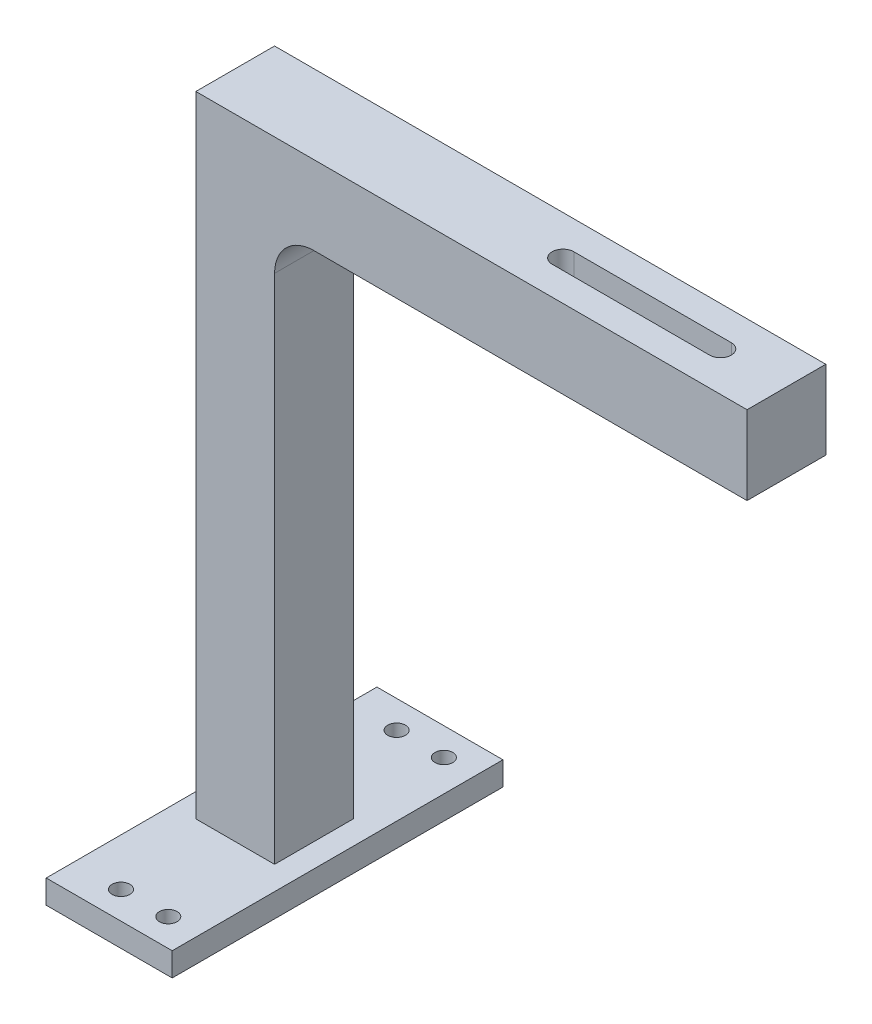
ISO-10303-21;
HEADER;
FILE_DESCRIPTION(('STEP AP214'),'2;1');
FILE_NAME('part.step','',(''),(''),'','','');
FILE_SCHEMA(('AUTOMOTIVE_DESIGN { 1 0 10303 214 1 1 1 1 }'));
ENDSEC;
DATA;
#1=APPLICATION_CONTEXT('core data for automotive mechanical design processes');
#2=APPLICATION_PROTOCOL_DEFINITION('international standard','automotive_design',2000,#1);
#3=PRODUCT_CONTEXT('',#1,'mechanical');
#4=PRODUCT('Part','Part','',(#3));
#5=PRODUCT_RELATED_PRODUCT_CATEGORY('part','',(#4));
#6=PRODUCT_DEFINITION_FORMATION('','',#4);
#7=PRODUCT_DEFINITION_CONTEXT('part definition',#1,'design');
#8=PRODUCT_DEFINITION('design','',#6,#7);
#9=PRODUCT_DEFINITION_SHAPE('','',#8);
#10=(LENGTH_UNIT() NAMED_UNIT(*) SI_UNIT(.MILLI.,.METRE.));
#11=(NAMED_UNIT(*) PLANE_ANGLE_UNIT() SI_UNIT($,.RADIAN.));
#12=(NAMED_UNIT(*) SI_UNIT($,.STERADIAN.) SOLID_ANGLE_UNIT());
#13=UNCERTAINTY_MEASURE_WITH_UNIT(LENGTH_MEASURE(1.E-05),#10,'distance_accuracy_value','');
#14=(GEOMETRIC_REPRESENTATION_CONTEXT(3) GLOBAL_UNCERTAINTY_ASSIGNED_CONTEXT((#13)) GLOBAL_UNIT_ASSIGNED_CONTEXT((#10,
#11,#12)) REPRESENTATION_CONTEXT('',''));
#15=CARTESIAN_POINT('',(0.,0.,0.));
#16=DIRECTION('',(0.,0.,1.));
#17=DIRECTION('',(1.,0.,0.));
#18=AXIS2_PLACEMENT_3D('',#15,#16,#17);
#19=CARTESIAN_POINT('',(74.,166.,-10.));
#20=DIRECTION('',(-1.,0.,0.));
#21=DIRECTION('',(0.,0.,1.));
#22=AXIS2_PLACEMENT_3D('',#19,#20,#21);
#23=PLANE('',#22);
#24=DIRECTION('',(0.,-1.,0.));
#25=VECTOR('',#24,1.);
#26=CARTESIAN_POINT('',(74.,166.,-10.));
#27=LINE('',#26,#25);
#28=CARTESIAN_POINT('',(74.,136.,-10.));
#29=VERTEX_POINT('',#28);
#30=CARTESIAN_POINT('',(74.,6.,-10.));
#31=VERTEX_POINT('',#30);
#32=EDGE_CURVE('E216',#29,#31,#27,.T.);
#33=ORIENTED_EDGE('',*,*,#32,.F.);
#34=DIRECTION('',(0.,0.,-1.));
#35=VECTOR('',#34,1.);
#36=CARTESIAN_POINT('',(74.,136.,9.99999999999999));
#37=LINE('',#36,#35);
#38=CARTESIAN_POINT('',(74.,136.,9.99999999999999));
#39=VERTEX_POINT('',#38);
#40=EDGE_CURVE('E274',#29,#39,#37,.F.);
#41=ORIENTED_EDGE('',*,*,#40,.T.);
#42=DIRECTION('',(0.,-1.,0.));
#43=VECTOR('',#42,1.);
#44=CARTESIAN_POINT('',(74.,166.,9.99999999999999));
#45=LINE('',#44,#43);
#46=CARTESIAN_POINT('',(74.,6.,9.99999999999999));
#47=VERTEX_POINT('',#46);
#48=EDGE_CURVE('E196',#39,#47,#45,.T.);
#49=ORIENTED_EDGE('',*,*,#48,.T.);
#50=DIRECTION('',(0.,0.,-1.));
#51=VECTOR('',#50,1.);
#52=CARTESIAN_POINT('',(74.,6.,-10.));
#53=LINE('',#52,#51);
#54=EDGE_CURVE('E187',#47,#31,#53,.T.);
#55=ORIENTED_EDGE('',*,*,#54,.T.);
#56=EDGE_LOOP('',(#33,#41,#49,#55));
#57=FACE_BOUND('',#56,.T.);
#58=ADVANCED_FACE('F39',(#57),#23,.F.);
#59=CARTESIAN_POINT('',(0.,6.,0.));
#60=DIRECTION('',(0.,-1.,0.));
#61=DIRECTION('',(0.,0.,-1.));
#62=AXIS2_PLACEMENT_3D('',#59,#60,#61);
#63=PLANE('',#62);
#64=DIRECTION('',(0.,0.,1.));
#65=VECTOR('',#64,1.);
#66=CARTESIAN_POINT('',(48.,6.,-42.));
#67=LINE('',#66,#65);
#68=CARTESIAN_POINT('',(48.,6.,-42.));
#69=VERTEX_POINT('',#68);
#70=CARTESIAN_POINT('',(48.,6.,42.));
#71=VERTEX_POINT('',#70);
#72=EDGE_CURVE('E245',#69,#71,#67,.T.);
#73=ORIENTED_EDGE('',*,*,#72,.T.);
#74=DIRECTION('',(1.,0.,0.));
#75=VECTOR('',#74,1.);
#76=CARTESIAN_POINT('',(80.,6.,42.));
#77=LINE('',#76,#75);
#78=CARTESIAN_POINT('',(80.,6.,42.));
#79=VERTEX_POINT('',#78);
#80=EDGE_CURVE('E247',#71,#79,#77,.T.);
#81=ORIENTED_EDGE('',*,*,#80,.T.);
#82=DIRECTION('',(0.,0.,-1.));
#83=VECTOR('',#82,1.);
#84=CARTESIAN_POINT('',(80.,6.,-42.));
#85=LINE('',#84,#83);
#86=CARTESIAN_POINT('',(80.,6.,-42.));
#87=VERTEX_POINT('',#86);
#88=EDGE_CURVE('E246',#79,#87,#85,.T.);
#89=ORIENTED_EDGE('',*,*,#88,.T.);
#90=DIRECTION('',(-1.,0.,0.));
#91=VECTOR('',#90,1.);
#92=CARTESIAN_POINT('',(80.,6.,-42.));
#93=LINE('',#92,#91);
#94=EDGE_CURVE('E253',#87,#69,#93,.T.);
#95=ORIENTED_EDGE('',*,*,#94,.T.);
#96=EDGE_LOOP('',(#73,#81,#89,#95));
#97=FACE_BOUND('',#96,.T.);
#98=CARTESIAN_POINT('',(72.,6.,35.));
#99=DIRECTION('',(0.,1.,0.));
#100=DIRECTION('',(0.,0.,1.));
#101=AXIS2_PLACEMENT_3D('',#98,#99,#100);
#102=CIRCLE('',#101,2.24999999999999);
#103=CARTESIAN_POINT('',(72.,6.,37.25));
#104=VERTEX_POINT('',#103);
#105=EDGE_CURVE('E237',#104,#104,#102,.T.);
#106=ORIENTED_EDGE('',*,*,#105,.F.);
#107=EDGE_LOOP('',(#106));
#108=FACE_BOUND('',#107,.T.);
#109=CARTESIAN_POINT('',(60.,6.,35.));
#110=DIRECTION('',(0.,1.,0.));
#111=DIRECTION('',(0.,0.,1.));
#112=AXIS2_PLACEMENT_3D('',#109,#110,#111);
#113=CIRCLE('',#112,2.24999999999999);
#114=CARTESIAN_POINT('',(60.,6.,37.25));
#115=VERTEX_POINT('',#114);
#116=EDGE_CURVE('E227',#115,#115,#113,.T.);
#117=ORIENTED_EDGE('',*,*,#116,.F.);
#118=EDGE_LOOP('',(#117));
#119=FACE_BOUND('',#118,.T.);
#120=CARTESIAN_POINT('',(72.,6.,-35.));
#121=DIRECTION('',(0.,1.,0.));
#122=DIRECTION('',(0.,0.,1.));
#123=AXIS2_PLACEMENT_3D('',#120,#121,#122);
#124=CIRCLE('',#123,2.24999999999999);
#125=CARTESIAN_POINT('',(72.,6.,-32.75));
#126=VERTEX_POINT('',#125);
#127=EDGE_CURVE('E221',#126,#126,#124,.T.);
#128=ORIENTED_EDGE('',*,*,#127,.F.);
#129=EDGE_LOOP('',(#128));
#130=FACE_BOUND('',#129,.T.);
#131=CARTESIAN_POINT('',(60.,6.,-35.));
#132=DIRECTION('',(0.,1.,0.));
#133=DIRECTION('',(0.,0.,1.));
#134=AXIS2_PLACEMENT_3D('',#131,#132,#133);
#135=CIRCLE('',#134,2.24999999999999);
#136=CARTESIAN_POINT('',(60.,6.,-32.75));
#137=VERTEX_POINT('',#136);
#138=EDGE_CURVE('E217',#137,#137,#135,.T.);
#139=ORIENTED_EDGE('',*,*,#138,.F.);
#140=EDGE_LOOP('',(#139));
#141=FACE_BOUND('',#140,.T.);
#142=ORIENTED_EDGE('',*,*,#54,.F.);
#143=DIRECTION('',(1.,0.,0.));
#144=VECTOR('',#143,1.);
#145=CARTESIAN_POINT('',(54.,6.,9.99999999999999));
#146=LINE('',#145,#144);
#147=CARTESIAN_POINT('',(54.,6.,9.99999999999999));
#148=VERTEX_POINT('',#147);
#149=EDGE_CURVE('E191',#148,#47,#146,.T.);
#150=ORIENTED_EDGE('',*,*,#149,.F.);
#151=DIRECTION('',(0.,0.,1.));
#152=VECTOR('',#151,1.);
#153=CARTESIAN_POINT('',(54.,6.,-10.));
#154=LINE('',#153,#152);
#155=CARTESIAN_POINT('',(54.,6.,-10.));
#156=VERTEX_POINT('',#155);
#157=EDGE_CURVE('E204',#156,#148,#154,.T.);
#158=ORIENTED_EDGE('',*,*,#157,.F.);
#159=DIRECTION('',(-1.,0.,0.));
#160=VECTOR('',#159,1.);
#161=CARTESIAN_POINT('',(54.,6.,-10.));
#162=LINE('',#161,#160);
#163=EDGE_CURVE('E203',#31,#156,#162,.T.);
#164=ORIENTED_EDGE('',*,*,#163,.F.);
#165=EDGE_LOOP('',(#142,#150,#158,#164));
#166=FACE_BOUND('',#165,.T.);
#167=ADVANCED_FACE('F301',(#97,#108,#119,#130,#141,#166),#63,.F.);
#168=CARTESIAN_POINT('',(48.,6.,-42.));
#169=DIRECTION('',(1.,0.,0.));
#170=DIRECTION('',(0.,0.,-1.));
#171=AXIS2_PLACEMENT_3D('',#168,#169,#170);
#172=PLANE('',#171);
#173=DIRECTION('',(0.,0.,1.));
#174=VECTOR('',#173,1.);
#175=CARTESIAN_POINT('',(48.,0.,-42.));
#176=LINE('',#175,#174);
#177=CARTESIAN_POINT('',(48.,0.,-42.));
#178=VERTEX_POINT('',#177);
#179=CARTESIAN_POINT('',(48.,0.,42.));
#180=VERTEX_POINT('',#179);
#181=EDGE_CURVE('E241',#178,#180,#176,.T.);
#182=ORIENTED_EDGE('',*,*,#181,.T.);
#183=DIRECTION('',(0.,-1.,0.));
#184=VECTOR('',#183,1.);
#185=CARTESIAN_POINT('',(48.,6.,42.));
#186=LINE('',#185,#184);
#187=EDGE_CURVE('E267',#71,#180,#186,.T.);
#188=ORIENTED_EDGE('',*,*,#187,.F.);
#189=ORIENTED_EDGE('',*,*,#72,.F.);
#190=DIRECTION('',(0.,-1.,0.));
#191=VECTOR('',#190,1.);
#192=CARTESIAN_POINT('',(48.,6.,-42.));
#193=LINE('',#192,#191);
#194=EDGE_CURVE('E251',#69,#178,#193,.T.);
#195=ORIENTED_EDGE('',*,*,#194,.T.);
#196=EDGE_LOOP('',(#182,#188,#189,#195));
#197=FACE_BOUND('',#196,.T.);
#198=ADVANCED_FACE('F315',(#197),#172,.F.);
#199=CARTESIAN_POINT('',(80.,6.,42.));
#200=DIRECTION('',(0.,0.,-1.));
#201=DIRECTION('',(-1.,0.,0.));
#202=AXIS2_PLACEMENT_3D('',#199,#200,#201);
#203=PLANE('',#202);
#204=DIRECTION('',(1.,0.,0.));
#205=VECTOR('',#204,1.);
#206=CARTESIAN_POINT('',(80.,0.,42.));
#207=LINE('',#206,#205);
#208=CARTESIAN_POINT('',(80.,0.,42.));
#209=VERTEX_POINT('',#208);
#210=EDGE_CURVE('E258',#180,#209,#207,.T.);
#211=ORIENTED_EDGE('',*,*,#210,.T.);
#212=DIRECTION('',(0.,-1.,0.));
#213=VECTOR('',#212,1.);
#214=CARTESIAN_POINT('',(80.,6.,42.));
#215=LINE('',#214,#213);
#216=EDGE_CURVE('E266',#79,#209,#215,.T.);
#217=ORIENTED_EDGE('',*,*,#216,.F.);
#218=ORIENTED_EDGE('',*,*,#80,.F.);
#219=ORIENTED_EDGE('',*,*,#187,.T.);
#220=EDGE_LOOP('',(#211,#217,#218,#219));
#221=FACE_BOUND('',#220,.T.);
#222=ADVANCED_FACE('F350',(#221),#203,.F.);
#223=CARTESIAN_POINT('',(80.,6.,-42.));
#224=DIRECTION('',(-1.,0.,0.));
#225=DIRECTION('',(0.,0.,1.));
#226=AXIS2_PLACEMENT_3D('',#223,#224,#225);
#227=PLANE('',#226);
#228=DIRECTION('',(0.,0.,-1.));
#229=VECTOR('',#228,1.);
#230=CARTESIAN_POINT('',(80.,0.,-42.));
#231=LINE('',#230,#229);
#232=CARTESIAN_POINT('',(80.,0.,-42.));
#233=VERTEX_POINT('',#232);
#234=EDGE_CURVE('E256',#209,#233,#231,.T.);
#235=ORIENTED_EDGE('',*,*,#234,.T.);
#236=DIRECTION('',(0.,-1.,0.));
#237=VECTOR('',#236,1.);
#238=CARTESIAN_POINT('',(80.,6.,-42.));
#239=LINE('',#238,#237);
#240=EDGE_CURVE('E263',#87,#233,#239,.T.);
#241=ORIENTED_EDGE('',*,*,#240,.F.);
#242=ORIENTED_EDGE('',*,*,#88,.F.);
#243=ORIENTED_EDGE('',*,*,#216,.T.);
#244=EDGE_LOOP('',(#235,#241,#242,#243));
#245=FACE_BOUND('',#244,.T.);
#246=ADVANCED_FACE('F344',(#245),#227,.F.);
#247=CARTESIAN_POINT('',(80.,6.,-42.));
#248=DIRECTION('',(0.,0.,1.));
#249=DIRECTION('',(1.,0.,0.));
#250=AXIS2_PLACEMENT_3D('',#247,#248,#249);
#251=PLANE('',#250);
#252=DIRECTION('',(-1.,0.,0.));
#253=VECTOR('',#252,1.);
#254=CARTESIAN_POINT('',(80.,0.,-42.));
#255=LINE('',#254,#253);
#256=EDGE_CURVE('E250',#233,#178,#255,.T.);
#257=ORIENTED_EDGE('',*,*,#256,.T.);
#258=ORIENTED_EDGE('',*,*,#194,.F.);
#259=ORIENTED_EDGE('',*,*,#94,.F.);
#260=ORIENTED_EDGE('',*,*,#240,.T.);
#261=EDGE_LOOP('',(#257,#258,#259,#260));
#262=FACE_BOUND('',#261,.T.);
#263=ADVANCED_FACE('F338',(#262),#251,.F.);
#264=CARTESIAN_POINT('',(0.,0.,0.));
#265=DIRECTION('',(0.,-1.,0.));
#266=DIRECTION('',(0.,0.,-1.));
#267=AXIS2_PLACEMENT_3D('',#264,#265,#266);
#268=PLANE('',#267);
#269=CARTESIAN_POINT('',(60.,0.,-35.));
#270=DIRECTION('',(0.,1.,0.));
#271=DIRECTION('',(0.,0.,1.));
#272=AXIS2_PLACEMENT_3D('',#269,#270,#271);
#273=CIRCLE('',#272,2.25);
#274=CARTESIAN_POINT('',(60.,0.,-32.75));
#275=VERTEX_POINT('',#274);
#276=EDGE_CURVE('E222',#275,#275,#273,.T.);
#277=ORIENTED_EDGE('',*,*,#276,.T.);
#278=EDGE_LOOP('',(#277));
#279=FACE_BOUND('',#278,.T.);
#280=CARTESIAN_POINT('',(72.,0.,-35.));
#281=DIRECTION('',(0.,1.,0.));
#282=DIRECTION('',(0.,0.,1.));
#283=AXIS2_PLACEMENT_3D('',#280,#281,#282);
#284=CIRCLE('',#283,2.25);
#285=CARTESIAN_POINT('',(72.,0.,-32.75));
#286=VERTEX_POINT('',#285);
#287=EDGE_CURVE('E226',#286,#286,#284,.T.);
#288=ORIENTED_EDGE('',*,*,#287,.T.);
#289=EDGE_LOOP('',(#288));
#290=FACE_BOUND('',#289,.T.);
#291=CARTESIAN_POINT('',(60.,0.,35.));
#292=DIRECTION('',(0.,1.,0.));
#293=DIRECTION('',(0.,0.,1.));
#294=AXIS2_PLACEMENT_3D('',#291,#292,#293);
#295=CIRCLE('',#294,2.25);
#296=CARTESIAN_POINT('',(60.,0.,37.25));
#297=VERTEX_POINT('',#296);
#298=EDGE_CURVE('E234',#297,#297,#295,.T.);
#299=ORIENTED_EDGE('',*,*,#298,.T.);
#300=EDGE_LOOP('',(#299));
#301=FACE_BOUND('',#300,.T.);
#302=CARTESIAN_POINT('',(72.,0.,35.));
#303=DIRECTION('',(0.,1.,0.));
#304=DIRECTION('',(0.,0.,1.));
#305=AXIS2_PLACEMENT_3D('',#302,#303,#304);
#306=CIRCLE('',#305,2.25);
#307=CARTESIAN_POINT('',(72.,0.,37.25));
#308=VERTEX_POINT('',#307);
#309=EDGE_CURVE('E239',#308,#308,#306,.T.);
#310=ORIENTED_EDGE('',*,*,#309,.T.);
#311=EDGE_LOOP('',(#310));
#312=FACE_BOUND('',#311,.T.);
#313=ORIENTED_EDGE('',*,*,#181,.F.);
#314=ORIENTED_EDGE('',*,*,#256,.F.);
#315=ORIENTED_EDGE('',*,*,#234,.F.);
#316=ORIENTED_EDGE('',*,*,#210,.F.);
#317=EDGE_LOOP('',(#313,#314,#315,#316));
#318=FACE_BOUND('',#317,.T.);
#319=ADVANCED_FACE('F331',(#279,#290,#301,#312,#318),#268,.T.);
#320=CARTESIAN_POINT('',(72.,6.,35.));
#321=DIRECTION('',(0.,1.,0.));
#322=DIRECTION('',(0.,0.,1.));
#323=AXIS2_PLACEMENT_3D('',#320,#321,#322);
#324=CYLINDRICAL_SURFACE('',#323,2.25);
#325=ORIENTED_EDGE('',*,*,#309,.F.);
#326=EDGE_LOOP('',(#325));
#327=FACE_BOUND('',#326,.T.);
#328=ORIENTED_EDGE('',*,*,#105,.T.);
#329=EDGE_LOOP('',(#328));
#330=FACE_BOUND('',#329,.T.);
#331=ADVANCED_FACE('F332',(#327,#330),#324,.F.);
#332=CARTESIAN_POINT('',(60.,6.,35.));
#333=DIRECTION('',(0.,1.,0.));
#334=DIRECTION('',(0.,0.,1.));
#335=AXIS2_PLACEMENT_3D('',#332,#333,#334);
#336=CYLINDRICAL_SURFACE('',#335,2.25);
#337=ORIENTED_EDGE('',*,*,#298,.F.);
#338=EDGE_LOOP('',(#337));
#339=FACE_BOUND('',#338,.T.);
#340=ORIENTED_EDGE('',*,*,#116,.T.);
#341=EDGE_LOOP('',(#340));
#342=FACE_BOUND('',#341,.T.);
#343=ADVANCED_FACE('F330',(#339,#342),#336,.F.);
#344=CARTESIAN_POINT('',(72.,6.,-35.));
#345=DIRECTION('',(0.,1.,0.));
#346=DIRECTION('',(0.,0.,1.));
#347=AXIS2_PLACEMENT_3D('',#344,#345,#346);
#348=CYLINDRICAL_SURFACE('',#347,2.25);
#349=ORIENTED_EDGE('',*,*,#287,.F.);
#350=EDGE_LOOP('',(#349));
#351=FACE_BOUND('',#350,.T.);
#352=ORIENTED_EDGE('',*,*,#127,.T.);
#353=EDGE_LOOP('',(#352));
#354=FACE_BOUND('',#353,.T.);
#355=ADVANCED_FACE('F323',(#351,#354),#348,.F.);
#356=CARTESIAN_POINT('',(60.,6.,-35.));
#357=DIRECTION('',(0.,1.,0.));
#358=DIRECTION('',(0.,0.,1.));
#359=AXIS2_PLACEMENT_3D('',#356,#357,#358);
#360=CYLINDRICAL_SURFACE('',#359,2.25);
#361=ORIENTED_EDGE('',*,*,#276,.F.);
#362=EDGE_LOOP('',(#361));
#363=FACE_BOUND('',#362,.T.);
#364=ORIENTED_EDGE('',*,*,#138,.T.);
#365=EDGE_LOOP('',(#364));
#366=FACE_BOUND('',#365,.T.);
#367=ADVANCED_FACE('F319',(#363,#366),#360,.F.);
#368=CARTESIAN_POINT('',(54.,166.,-10.));
#369=DIRECTION('',(0.,0.,1.));
#370=DIRECTION('',(1.,0.,0.));
#371=AXIS2_PLACEMENT_3D('',#368,#369,#370);
#372=PLANE('',#371);
#373=ORIENTED_EDGE('',*,*,#163,.T.);
#374=DIRECTION('',(0.,-1.,0.));
#375=VECTOR('',#374,1.);
#376=CARTESIAN_POINT('',(54.,166.,-10.));
#377=LINE('',#376,#375);
#378=CARTESIAN_POINT('',(54.,166.,-10.));
#379=VERTEX_POINT('',#378);
#380=EDGE_CURVE('E213',#379,#156,#377,.T.);
#381=ORIENTED_EDGE('',*,*,#380,.F.);
#382=DIRECTION('',(-1.,0.,0.));
#383=VECTOR('',#382,1.);
#384=CARTESIAN_POINT('',(54.,166.,-10.));
#385=LINE('',#384,#383);
#386=CARTESIAN_POINT('',(194.,166.,-10.));
#387=VERTEX_POINT('',#386);
#388=EDGE_CURVE('E192',#387,#379,#385,.T.);
#389=ORIENTED_EDGE('',*,*,#388,.F.);
#390=DIRECTION('',(0.,1.,0.));
#391=VECTOR('',#390,1.);
#392=CARTESIAN_POINT('',(194.,166.,-10.));
#393=LINE('',#392,#391);
#394=CARTESIAN_POINT('',(194.,146.,-10.));
#395=VERTEX_POINT('',#394);
#396=EDGE_CURVE('E179',#395,#387,#393,.T.);
#397=ORIENTED_EDGE('',*,*,#396,.F.);
#398=DIRECTION('',(1.,0.,0.));
#399=VECTOR('',#398,1.);
#400=CARTESIAN_POINT('',(74.,146.,-10.));
#401=LINE('',#400,#399);
#402=CARTESIAN_POINT('',(84.,146.,-10.));
#403=VERTEX_POINT('',#402);
#404=EDGE_CURVE('E171',#403,#395,#401,.T.);
#405=ORIENTED_EDGE('',*,*,#404,.F.);
#406=CARTESIAN_POINT('',(84.,136.,-10.));
#407=DIRECTION('',(0.,0.,1.));
#408=DIRECTION('',(1.,0.,0.));
#409=AXIS2_PLACEMENT_3D('',#406,#407,#408);
#410=CIRCLE('',#409,10.);
#411=EDGE_CURVE('E280',#403,#29,#410,.T.);
#412=ORIENTED_EDGE('',*,*,#411,.T.);
#413=ORIENTED_EDGE('',*,*,#32,.T.);
#414=EDGE_LOOP('',(#373,#381,#389,#397,#405,#412,#413));
#415=FACE_BOUND('',#414,.T.);
#416=ADVANCED_FACE('F318',(#415),#372,.F.);
#417=CARTESIAN_POINT('',(54.,166.,-10.));
#418=DIRECTION('',(1.,0.,0.));
#419=DIRECTION('',(0.,0.,-1.));
#420=AXIS2_PLACEMENT_3D('',#417,#418,#419);
#421=PLANE('',#420);
#422=ORIENTED_EDGE('',*,*,#157,.T.);
#423=DIRECTION('',(0.,-1.,0.));
#424=VECTOR('',#423,1.);
#425=CARTESIAN_POINT('',(54.,166.,9.99999999999999));
#426=LINE('',#425,#424);
#427=CARTESIAN_POINT('',(54.,166.,9.99999999999999));
#428=VERTEX_POINT('',#427);
#429=EDGE_CURVE('E209',#428,#148,#426,.T.);
#430=ORIENTED_EDGE('',*,*,#429,.F.);
#431=DIRECTION('',(0.,0.,1.));
#432=VECTOR('',#431,1.);
#433=CARTESIAN_POINT('',(54.,166.,-10.));
#434=LINE('',#433,#432);
#435=EDGE_CURVE('E194',#379,#428,#434,.T.);
#436=ORIENTED_EDGE('',*,*,#435,.F.);
#437=ORIENTED_EDGE('',*,*,#380,.T.);
#438=EDGE_LOOP('',(#422,#430,#436,#437));
#439=FACE_BOUND('',#438,.T.);
#440=ADVANCED_FACE('F384',(#439),#421,.F.);
#441=CARTESIAN_POINT('',(54.,166.,9.99999999999999));
#442=DIRECTION('',(0.,0.,-1.));
#443=DIRECTION('',(-1.,0.,0.));
#444=AXIS2_PLACEMENT_3D('',#441,#442,#443);
#445=PLANE('',#444);
#446=ORIENTED_EDGE('',*,*,#149,.T.);
#447=ORIENTED_EDGE('',*,*,#48,.F.);
#448=CARTESIAN_POINT('',(84.,136.,9.99999999999999));
#449=DIRECTION('',(0.,0.,-1.));
#450=DIRECTION('',(-1.,0.,0.));
#451=AXIS2_PLACEMENT_3D('',#448,#449,#450);
#452=CIRCLE('',#451,10.);
#453=CARTESIAN_POINT('',(84.,146.,10.));
#454=VERTEX_POINT('',#453);
#455=EDGE_CURVE('E276',#39,#454,#452,.T.);
#456=ORIENTED_EDGE('',*,*,#455,.T.);
#457=DIRECTION('',(1.,0.,0.));
#458=VECTOR('',#457,1.);
#459=CARTESIAN_POINT('',(74.,146.,10.));
#460=LINE('',#459,#458);
#461=CARTESIAN_POINT('',(194.,146.,10.));
#462=VERTEX_POINT('',#461);
#463=EDGE_CURVE('E172',#454,#462,#460,.T.);
#464=ORIENTED_EDGE('',*,*,#463,.T.);
#465=DIRECTION('',(0.,1.,0.));
#466=VECTOR('',#465,1.);
#467=CARTESIAN_POINT('',(194.,166.,10.));
#468=LINE('',#467,#466);
#469=CARTESIAN_POINT('',(194.,166.,10.));
#470=VERTEX_POINT('',#469);
#471=EDGE_CURVE('E180',#462,#470,#468,.T.);
#472=ORIENTED_EDGE('',*,*,#471,.T.);
#473=DIRECTION('',(1.,0.,0.));
#474=VECTOR('',#473,1.);
#475=CARTESIAN_POINT('',(54.,166.,9.99999999999999));
#476=LINE('',#475,#474);
#477=EDGE_CURVE('E198',#428,#470,#476,.T.);
#478=ORIENTED_EDGE('',*,*,#477,.F.);
#479=ORIENTED_EDGE('',*,*,#429,.T.);
#480=EDGE_LOOP('',(#446,#447,#456,#464,#472,#478,#479));
#481=FACE_BOUND('',#480,.T.);
#482=ADVANCED_FACE('F377',(#481),#445,.F.);
#483=CARTESIAN_POINT('',(0.,166.,0.));
#484=DIRECTION('',(0.,1.,0.));
#485=DIRECTION('',(0.,0.,1.));
#486=AXIS2_PLACEMENT_3D('',#483,#484,#485);
#487=PLANE('',#486);
#488=CARTESIAN_POINT('',(177.25,166.,0.));
#489=DIRECTION('',(0.,1.,0.));
#490=DIRECTION('',(0.,0.,1.));
#491=AXIS2_PLACEMENT_3D('',#488,#489,#490);
#492=CIRCLE('',#491,2.75);
#493=CARTESIAN_POINT('',(177.25,166.,2.75));
#494=VERTEX_POINT('',#493);
#495=CARTESIAN_POINT('',(177.25,166.,-2.75));
#496=VERTEX_POINT('',#495);
#497=EDGE_CURVE('E53',#494,#496,#492,.T.);
#498=ORIENTED_EDGE('',*,*,#497,.F.);
#499=DIRECTION('',(1.,0.,0.));
#500=VECTOR('',#499,1.);
#501=CARTESIAN_POINT('',(177.25,166.,2.75));
#502=LINE('',#501,#500);
#503=CARTESIAN_POINT('',(137.25,166.,2.75000000000001));
#504=VERTEX_POINT('',#503);
#505=EDGE_CURVE('E164',#504,#494,#502,.T.);
#506=ORIENTED_EDGE('',*,*,#505,.F.);
#507=CARTESIAN_POINT('',(137.25,166.,0.));
#508=DIRECTION('',(0.,1.,0.));
#509=DIRECTION('',(0.,0.,1.));
#510=AXIS2_PLACEMENT_3D('',#507,#508,#509);
#511=CIRCLE('',#510,2.75);
#512=CARTESIAN_POINT('',(137.25,166.,-2.74999999999999));
#513=VERTEX_POINT('',#512);
#514=EDGE_CURVE('E149',#513,#504,#511,.T.);
#515=ORIENTED_EDGE('',*,*,#514,.F.);
#516=DIRECTION('',(-1.,0.,0.));
#517=VECTOR('',#516,1.);
#518=CARTESIAN_POINT('',(177.25,166.,-2.75));
#519=LINE('',#518,#517);
#520=EDGE_CURVE('E158',#496,#513,#519,.T.);
#521=ORIENTED_EDGE('',*,*,#520,.F.);
#522=EDGE_LOOP('',(#498,#506,#515,#521));
#523=FACE_BOUND('',#522,.T.);
#524=ORIENTED_EDGE('',*,*,#477,.T.);
#525=DIRECTION('',(0.,0.,-1.));
#526=VECTOR('',#525,1.);
#527=CARTESIAN_POINT('',(194.,166.,10.));
#528=LINE('',#527,#526);
#529=EDGE_CURVE('E182',#470,#387,#528,.T.);
#530=ORIENTED_EDGE('',*,*,#529,.T.);
#531=ORIENTED_EDGE('',*,*,#388,.T.);
#532=ORIENTED_EDGE('',*,*,#435,.T.);
#533=EDGE_LOOP('',(#524,#530,#531,#532));
#534=FACE_BOUND('',#533,.T.);
#535=ADVANCED_FACE('F165',(#523,#534),#487,.T.);
#536=CARTESIAN_POINT('',(74.,146.,10.));
#537=DIRECTION('',(0.,1.,0.));
#538=DIRECTION('',(0.,0.,1.));
#539=AXIS2_PLACEMENT_3D('',#536,#537,#538);
#540=PLANE('',#539);
#541=DIRECTION('',(1.,0.,0.));
#542=VECTOR('',#541,1.);
#543=CARTESIAN_POINT('',(74.,146.,2.75000000000001));
#544=LINE('',#543,#542);
#545=CARTESIAN_POINT('',(137.25,146.,2.75000000000001));
#546=VERTEX_POINT('',#545);
#547=CARTESIAN_POINT('',(177.25,146.,2.75));
#548=VERTEX_POINT('',#547);
#549=EDGE_CURVE('E50',#546,#548,#544,.T.);
#550=ORIENTED_EDGE('',*,*,#549,.T.);
#551=CARTESIAN_POINT('',(177.25,146.,0.));
#552=DIRECTION('',(0.,1.,0.));
#553=DIRECTION('',(0.,0.,1.));
#554=AXIS2_PLACEMENT_3D('',#551,#552,#553);
#555=CIRCLE('',#554,2.75);
#556=CARTESIAN_POINT('',(177.25,146.,-2.75));
#557=VERTEX_POINT('',#556);
#558=EDGE_CURVE('E11',#548,#557,#555,.T.);
#559=ORIENTED_EDGE('',*,*,#558,.T.);
#560=DIRECTION('',(-1.,0.,0.));
#561=VECTOR('',#560,1.);
#562=CARTESIAN_POINT('',(74.,146.,-2.74999999999999));
#563=LINE('',#562,#561);
#564=CARTESIAN_POINT('',(137.25,146.,-2.75));
#565=VERTEX_POINT('',#564);
#566=EDGE_CURVE('E284',#557,#565,#563,.T.);
#567=ORIENTED_EDGE('',*,*,#566,.T.);
#568=CARTESIAN_POINT('',(137.25,146.,0.));
#569=DIRECTION('',(0.,1.,0.));
#570=DIRECTION('',(0.,0.,1.));
#571=AXIS2_PLACEMENT_3D('',#568,#569,#570);
#572=CIRCLE('',#571,2.75);
#573=EDGE_CURVE('E155',#565,#546,#572,.T.);
#574=ORIENTED_EDGE('',*,*,#573,.T.);
#575=EDGE_LOOP('',(#550,#559,#567,#574));
#576=FACE_BOUND('',#575,.T.);
#577=ORIENTED_EDGE('',*,*,#463,.F.);
#578=DIRECTION('',(0.,0.,-1.));
#579=VECTOR('',#578,1.);
#580=CARTESIAN_POINT('',(84.,146.,-10.));
#581=LINE('',#580,#579);
#582=EDGE_CURVE('E275',#454,#403,#581,.T.);
#583=ORIENTED_EDGE('',*,*,#582,.T.);
#584=ORIENTED_EDGE('',*,*,#404,.T.);
#585=DIRECTION('',(0.,0.,-1.));
#586=VECTOR('',#585,1.);
#587=CARTESIAN_POINT('',(194.,146.,10.));
#588=LINE('',#587,#586);
#589=EDGE_CURVE('E186',#462,#395,#588,.T.);
#590=ORIENTED_EDGE('',*,*,#589,.F.);
#591=EDGE_LOOP('',(#577,#583,#584,#590));
#592=FACE_BOUND('',#591,.T.);
#593=ADVANCED_FACE('F282',(#576,#592),#540,.F.);
#594=CARTESIAN_POINT('',(194.,166.,10.));
#595=DIRECTION('',(-1.,0.,0.));
#596=DIRECTION('',(0.,0.,1.));
#597=AXIS2_PLACEMENT_3D('',#594,#595,#596);
#598=PLANE('',#597);
#599=ORIENTED_EDGE('',*,*,#396,.T.);
#600=ORIENTED_EDGE('',*,*,#529,.F.);
#601=ORIENTED_EDGE('',*,*,#471,.F.);
#602=ORIENTED_EDGE('',*,*,#589,.T.);
#603=EDGE_LOOP('',(#599,#600,#601,#602));
#604=FACE_BOUND('',#603,.T.);
#605=ADVANCED_FACE('F298',(#604),#598,.F.);
#606=CARTESIAN_POINT('',(84.,136.,10.));
#607=DIRECTION('',(0.,0.,1.));
#608=DIRECTION('',(1.,0.,0.));
#609=AXIS2_PLACEMENT_3D('',#606,#607,#608);
#610=CYLINDRICAL_SURFACE('',#609,10.);
#611=ORIENTED_EDGE('',*,*,#455,.F.);
#612=ORIENTED_EDGE('',*,*,#40,.F.);
#613=ORIENTED_EDGE('',*,*,#411,.F.);
#614=ORIENTED_EDGE('',*,*,#582,.F.);
#615=EDGE_LOOP('',(#611,#612,#613,#614));
#616=FACE_BOUND('',#615,.T.);
#617=ADVANCED_FACE('F41',(#616),#610,.F.);
#618=CARTESIAN_POINT('',(177.25,0.,0.));
#619=DIRECTION('',(0.,1.,0.));
#620=DIRECTION('',(0.,0.,1.));
#621=AXIS2_PLACEMENT_3D('',#618,#619,#620);
#622=CYLINDRICAL_SURFACE('',#621,2.75);
#623=DIRECTION('',(0.,1.,0.));
#624=VECTOR('',#623,1.);
#625=CARTESIAN_POINT('',(177.25,0.,2.75));
#626=LINE('',#625,#624);
#627=EDGE_CURVE('E168',#548,#494,#626,.T.);
#628=ORIENTED_EDGE('',*,*,#627,.T.);
#629=ORIENTED_EDGE('',*,*,#497,.T.);
#630=DIRECTION('',(0.,1.,0.));
#631=VECTOR('',#630,1.);
#632=CARTESIAN_POINT('',(177.25,0.,-2.75));
#633=LINE('',#632,#631);
#634=EDGE_CURVE('E154',#557,#496,#633,.T.);
#635=ORIENTED_EDGE('',*,*,#634,.F.);
#636=ORIENTED_EDGE('',*,*,#558,.F.);
#637=EDGE_LOOP('',(#628,#629,#635,#636));
#638=FACE_BOUND('',#637,.T.);
#639=ADVANCED_FACE('F288',(#638),#622,.F.);
#640=CARTESIAN_POINT('',(177.25,0.,2.75));
#641=DIRECTION('',(0.,0.,1.));
#642=DIRECTION('',(1.,0.,0.));
#643=AXIS2_PLACEMENT_3D('',#640,#641,#642);
#644=PLANE('',#643);
#645=DIRECTION('',(0.,1.,0.));
#646=VECTOR('',#645,1.);
#647=CARTESIAN_POINT('',(137.25,0.,2.75000000000001));
#648=LINE('',#647,#646);
#649=EDGE_CURVE('E152',#546,#504,#648,.T.);
#650=ORIENTED_EDGE('',*,*,#649,.T.);
#651=ORIENTED_EDGE('',*,*,#505,.T.);
#652=ORIENTED_EDGE('',*,*,#627,.F.);
#653=ORIENTED_EDGE('',*,*,#549,.F.);
#654=EDGE_LOOP('',(#650,#651,#652,#653));
#655=FACE_BOUND('',#654,.T.);
#656=ADVANCED_FACE('F286',(#655),#644,.F.);
#657=CARTESIAN_POINT('',(137.25,0.,0.));
#658=DIRECTION('',(0.,1.,0.));
#659=DIRECTION('',(0.,0.,1.));
#660=AXIS2_PLACEMENT_3D('',#657,#658,#659);
#661=CYLINDRICAL_SURFACE('',#660,2.75);
#662=DIRECTION('',(0.,1.,0.));
#663=VECTOR('',#662,1.);
#664=CARTESIAN_POINT('',(137.25,0.,-2.74999999999999));
#665=LINE('',#664,#663);
#666=EDGE_CURVE('E61',#565,#513,#665,.T.);
#667=ORIENTED_EDGE('',*,*,#666,.T.);
#668=ORIENTED_EDGE('',*,*,#514,.T.);
#669=ORIENTED_EDGE('',*,*,#649,.F.);
#670=ORIENTED_EDGE('',*,*,#573,.F.);
#671=EDGE_LOOP('',(#667,#668,#669,#670));
#672=FACE_BOUND('',#671,.T.);
#673=ADVANCED_FACE('F148',(#672),#661,.F.);
#674=CARTESIAN_POINT('',(177.25,0.,-2.75));
#675=DIRECTION('',(0.,0.,-1.));
#676=DIRECTION('',(-1.,0.,0.));
#677=AXIS2_PLACEMENT_3D('',#674,#675,#676);
#678=PLANE('',#677);
#679=ORIENTED_EDGE('',*,*,#634,.T.);
#680=ORIENTED_EDGE('',*,*,#520,.T.);
#681=ORIENTED_EDGE('',*,*,#666,.F.);
#682=ORIENTED_EDGE('',*,*,#566,.F.);
#683=EDGE_LOOP('',(#679,#680,#681,#682));
#684=FACE_BOUND('',#683,.T.);
#685=ADVANCED_FACE('F157',(#684),#678,.F.);
#686=CLOSED_SHELL('',(#58,#167,#198,#222,#246,#263,#319,#331,#343,#355,#367,#416,#440,#482,#535,
#593,#605,#617,#639,#656,#673,#685));
#687=MANIFOLD_SOLID_BREP('B2',#686);
#688=ADVANCED_BREP_SHAPE_REPRESENTATION('',(#18,#687),#14);
#689=SHAPE_DEFINITION_REPRESENTATION(#9,#688);
ENDSEC;
END-ISO-10303-21;
